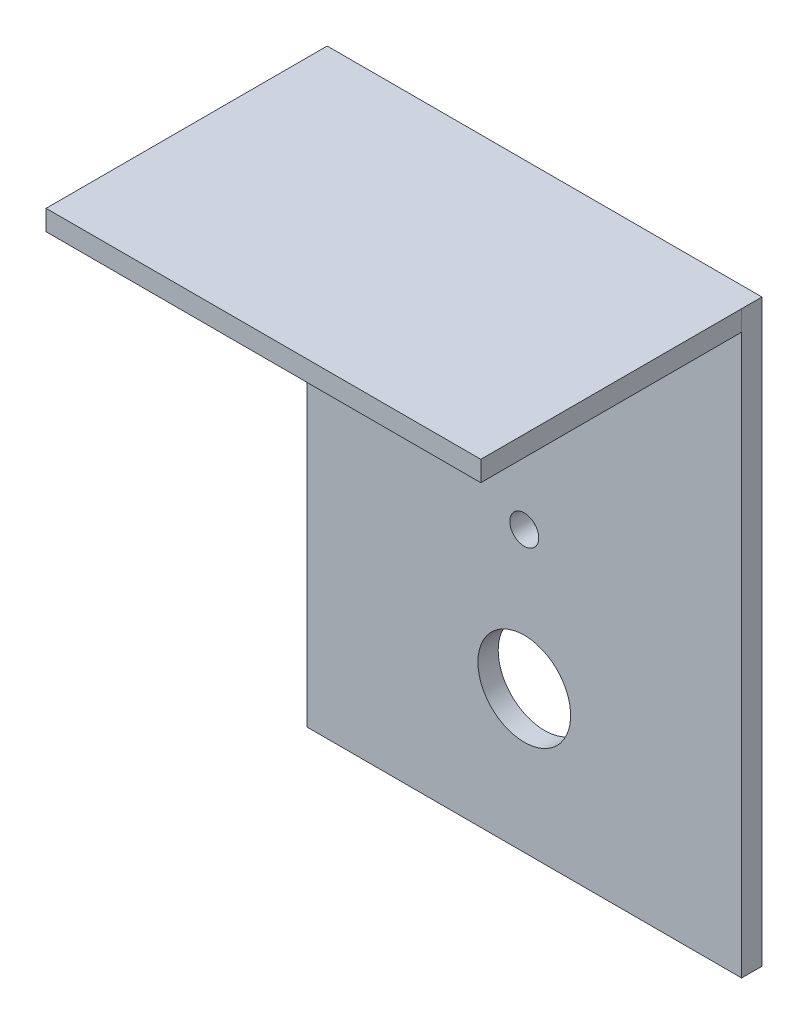
ISO-10303-21;
HEADER;
FILE_DESCRIPTION(('STEP AP214'),'2;1');
FILE_NAME('part.step','',(''),(''),'','','');
FILE_SCHEMA(('AUTOMOTIVE_DESIGN { 1 0 10303 214 1 1 1 1 }'));
ENDSEC;
DATA;
#1=APPLICATION_CONTEXT('core data for automotive mechanical design processes');
#2=APPLICATION_PROTOCOL_DEFINITION('international standard','automotive_design',2000,#1);
#3=PRODUCT_CONTEXT('',#1,'mechanical');
#4=PRODUCT('Part','Part','',(#3));
#5=PRODUCT_RELATED_PRODUCT_CATEGORY('part','',(#4));
#6=PRODUCT_DEFINITION_FORMATION('','',#4);
#7=PRODUCT_DEFINITION_CONTEXT('part definition',#1,'design');
#8=PRODUCT_DEFINITION('design','',#6,#7);
#9=PRODUCT_DEFINITION_SHAPE('','',#8);
#10=(LENGTH_UNIT() NAMED_UNIT(*) SI_UNIT(.MILLI.,.METRE.));
#11=(NAMED_UNIT(*) PLANE_ANGLE_UNIT() SI_UNIT($,.RADIAN.));
#12=(NAMED_UNIT(*) SI_UNIT($,.STERADIAN.) SOLID_ANGLE_UNIT());
#13=UNCERTAINTY_MEASURE_WITH_UNIT(LENGTH_MEASURE(1.E-05),#10,'distance_accuracy_value','');
#14=(GEOMETRIC_REPRESENTATION_CONTEXT(3) GLOBAL_UNCERTAINTY_ASSIGNED_CONTEXT((#13)) GLOBAL_UNIT_ASSIGNED_CONTEXT((#10,
#11,#12)) REPRESENTATION_CONTEXT('',''));
#15=CARTESIAN_POINT('',(0.,0.,0.));
#16=DIRECTION('',(0.,0.,1.));
#17=DIRECTION('',(1.,0.,0.));
#18=AXIS2_PLACEMENT_3D('',#15,#16,#17);
#19=CARTESIAN_POINT('',(0.,3.5,0.));
#20=DIRECTION('',(-1.,0.,0.));
#21=DIRECTION('',(0.,0.,1.));
#22=AXIS2_PLACEMENT_3D('',#19,#20,#21);
#23=PLANE('',#22);
#24=DIRECTION('',(0.,0.,-1.));
#25=VECTOR('',#24,1.);
#26=CARTESIAN_POINT('',(0.,0.,0.));
#27=LINE('',#26,#25);
#28=CARTESIAN_POINT('',(0.,0.,0.));
#29=VERTEX_POINT('',#28);
#30=CARTESIAN_POINT('',(0.,0.,-45.));
#31=VERTEX_POINT('',#30);
#32=EDGE_CURVE('E139',#29,#31,#27,.T.);
#33=ORIENTED_EDGE('',*,*,#32,.F.);
#34=DIRECTION('',(0.,-1.,0.));
#35=VECTOR('',#34,1.);
#36=CARTESIAN_POINT('',(0.,3.5,0.));
#37=LINE('',#36,#35);
#38=CARTESIAN_POINT('',(0.,3.5,0.));
#39=VERTEX_POINT('',#38);
#40=EDGE_CURVE('E11',#39,#29,#37,.T.);
#41=ORIENTED_EDGE('',*,*,#40,.F.);
#42=DIRECTION('',(0.,0.,-1.));
#43=VECTOR('',#42,1.);
#44=CARTESIAN_POINT('',(0.,3.5,0.));
#45=LINE('',#44,#43);
#46=CARTESIAN_POINT('',(0.,3.5,-48.5));
#47=VERTEX_POINT('',#46);
#48=EDGE_CURVE('E99',#39,#47,#45,.T.);
#49=ORIENTED_EDGE('',*,*,#48,.T.);
#50=DIRECTION('',(0.,1.,0.));
#51=VECTOR('',#50,1.);
#52=CARTESIAN_POINT('',(0.,3.5,-48.5));
#53=LINE('',#52,#51);
#54=CARTESIAN_POINT('',(0.,-96.5,-48.5));
#55=VERTEX_POINT('',#54);
#56=EDGE_CURVE('E103',#55,#47,#53,.T.);
#57=ORIENTED_EDGE('',*,*,#56,.F.);
#58=DIRECTION('',(0.,0.,1.));
#59=VECTOR('',#58,1.);
#60=CARTESIAN_POINT('',(0.,-96.5,-48.5));
#61=LINE('',#60,#59);
#62=CARTESIAN_POINT('',(0.,-96.5,-45.));
#63=VERTEX_POINT('',#62);
#64=EDGE_CURVE('E129',#55,#63,#61,.T.);
#65=ORIENTED_EDGE('',*,*,#64,.T.);
#66=DIRECTION('',(0.,1.,0.));
#67=VECTOR('',#66,1.);
#68=CARTESIAN_POINT('',(0.,3.5,-45.));
#69=LINE('',#68,#67);
#70=EDGE_CURVE('E130',#63,#31,#69,.T.);
#71=ORIENTED_EDGE('',*,*,#70,.T.);
#72=EDGE_LOOP('',(#33,#41,#49,#57,#65,#71));
#73=FACE_BOUND('',#72,.T.);
#74=ADVANCED_FACE('F33',(#73),#23,.T.);
#75=CARTESIAN_POINT('',(0.,3.5,0.));
#76=DIRECTION('',(0.,0.,-1.));
#77=DIRECTION('',(-1.,0.,0.));
#78=AXIS2_PLACEMENT_3D('',#75,#76,#77);
#79=PLANE('',#78);
#80=DIRECTION('',(1.,0.,0.));
#81=VECTOR('',#80,1.);
#82=CARTESIAN_POINT('',(0.,0.,0.));
#83=LINE('',#82,#81);
#84=CARTESIAN_POINT('',(75.,0.,0.));
#85=VERTEX_POINT('',#84);
#86=EDGE_CURVE('E105',#29,#85,#83,.T.);
#87=ORIENTED_EDGE('',*,*,#86,.T.);
#88=DIRECTION('',(0.,-1.,0.));
#89=VECTOR('',#88,1.);
#90=CARTESIAN_POINT('',(75.,3.5,0.));
#91=LINE('',#90,#89);
#92=CARTESIAN_POINT('',(75.,3.5,0.));
#93=VERTEX_POINT('',#92);
#94=EDGE_CURVE('E41',#93,#85,#91,.T.);
#95=ORIENTED_EDGE('',*,*,#94,.F.);
#96=DIRECTION('',(1.,0.,0.));
#97=VECTOR('',#96,1.);
#98=CARTESIAN_POINT('',(0.,3.5,0.));
#99=LINE('',#98,#97);
#100=EDGE_CURVE('E144',#39,#93,#99,.T.);
#101=ORIENTED_EDGE('',*,*,#100,.F.);
#102=ORIENTED_EDGE('',*,*,#40,.T.);
#103=EDGE_LOOP('',(#87,#95,#101,#102));
#104=FACE_BOUND('',#103,.T.);
#105=ADVANCED_FACE('F185',(#104),#79,.F.);
#106=CARTESIAN_POINT('',(75.,3.5,0.));
#107=DIRECTION('',(-1.,0.,0.));
#108=DIRECTION('',(0.,0.,1.));
#109=AXIS2_PLACEMENT_3D('',#106,#107,#108);
#110=PLANE('',#109);
#111=DIRECTION('',(0.,0.,-1.));
#112=VECTOR('',#111,1.);
#113=CARTESIAN_POINT('',(75.,0.,0.));
#114=LINE('',#113,#112);
#115=CARTESIAN_POINT('',(75.,0.,-45.));
#116=VERTEX_POINT('',#115);
#117=EDGE_CURVE('E150',#85,#116,#114,.T.);
#118=ORIENTED_EDGE('',*,*,#117,.T.);
#119=DIRECTION('',(0.,-1.,0.));
#120=VECTOR('',#119,1.);
#121=CARTESIAN_POINT('',(75.,3.5,-45.));
#122=LINE('',#121,#120);
#123=CARTESIAN_POINT('',(75.,3.5,-45.));
#124=VERTEX_POINT('',#123);
#125=EDGE_CURVE('E36',#124,#116,#122,.T.);
#126=ORIENTED_EDGE('',*,*,#125,.F.);
#127=DIRECTION('',(0.,0.,-1.));
#128=VECTOR('',#127,1.);
#129=CARTESIAN_POINT('',(75.,3.5,0.));
#130=LINE('',#129,#128);
#131=EDGE_CURVE('E142',#93,#124,#130,.T.);
#132=ORIENTED_EDGE('',*,*,#131,.F.);
#133=ORIENTED_EDGE('',*,*,#94,.T.);
#134=EDGE_LOOP('',(#118,#126,#132,#133));
#135=FACE_BOUND('',#134,.T.);
#136=ADVANCED_FACE('F161',(#135),#110,.F.);
#137=CARTESIAN_POINT('',(0.,3.5,-45.));
#138=DIRECTION('',(0.,0.,-1.));
#139=DIRECTION('',(-1.,0.,0.));
#140=AXIS2_PLACEMENT_3D('',#137,#138,#139);
#141=PLANE('',#140);
#142=DIRECTION('',(0.,-1.,0.));
#143=VECTOR('',#142,1.);
#144=CARTESIAN_POINT('',(74.9993374443676,3.5,-45.));
#145=LINE('',#144,#143);
#146=CARTESIAN_POINT('',(74.9993374443676,3.5,-45.));
#147=VERTEX_POINT('',#146);
#148=CARTESIAN_POINT('',(74.9993374443676,0.,-45.));
#149=VERTEX_POINT('',#148);
#150=EDGE_CURVE('E49',#147,#149,#145,.T.);
#151=ORIENTED_EDGE('',*,*,#150,.F.);
#152=DIRECTION('',(1.,0.,0.));
#153=VECTOR('',#152,1.);
#154=CARTESIAN_POINT('',(0.,3.5,-45.));
#155=LINE('',#154,#153);
#156=EDGE_CURVE('E76',#147,#124,#155,.T.);
#157=ORIENTED_EDGE('',*,*,#156,.T.);
#158=ORIENTED_EDGE('',*,*,#125,.T.);
#159=DIRECTION('',(1.,0.,0.));
#160=VECTOR('',#159,1.);
#161=CARTESIAN_POINT('',(0.,0.,-45.));
#162=LINE('',#161,#160);
#163=EDGE_CURVE('E147',#149,#116,#162,.T.);
#164=ORIENTED_EDGE('',*,*,#163,.F.);
#165=EDGE_LOOP('',(#151,#157,#158,#164));
#166=FACE_BOUND('',#165,.T.);
#167=ADVANCED_FACE('F159',(#166),#141,.T.);
#168=CARTESIAN_POINT('',(0.,3.5,0.));
#169=DIRECTION('',(0.,-1.,0.));
#170=DIRECTION('',(0.,0.,-1.));
#171=AXIS2_PLACEMENT_3D('',#168,#169,#170);
#172=PLANE('',#171);
#173=ORIENTED_EDGE('',*,*,#48,.F.);
#174=ORIENTED_EDGE('',*,*,#100,.T.);
#175=ORIENTED_EDGE('',*,*,#131,.T.);
#176=ORIENTED_EDGE('',*,*,#156,.F.);
#177=DIRECTION('',(0.,0.,1.));
#178=VECTOR('',#177,1.);
#179=CARTESIAN_POINT('',(74.9993374443676,3.5,-48.5));
#180=LINE('',#179,#178);
#181=CARTESIAN_POINT('',(74.9993374443676,3.5,-48.5));
#182=VERTEX_POINT('',#181);
#183=EDGE_CURVE('E111',#182,#147,#180,.T.);
#184=ORIENTED_EDGE('',*,*,#183,.F.);
#185=DIRECTION('',(1.,0.,0.));
#186=VECTOR('',#185,1.);
#187=CARTESIAN_POINT('',(0.,3.5,-48.5));
#188=LINE('',#187,#186);
#189=EDGE_CURVE('E108',#47,#182,#188,.T.);
#190=ORIENTED_EDGE('',*,*,#189,.F.);
#191=EDGE_LOOP('',(#173,#174,#175,#176,#184,#190));
#192=FACE_BOUND('',#191,.T.);
#193=ADVANCED_FACE('F109',(#192),#172,.F.);
#194=CARTESIAN_POINT('',(0.,0.,0.));
#195=DIRECTION('',(0.,-1.,0.));
#196=DIRECTION('',(0.,0.,-1.));
#197=AXIS2_PLACEMENT_3D('',#194,#195,#196);
#198=PLANE('',#197);
#199=ORIENTED_EDGE('',*,*,#32,.T.);
#200=EDGE_CURVE('E148',#31,#149,#162,.T.);
#201=ORIENTED_EDGE('',*,*,#200,.T.);
#202=ORIENTED_EDGE('',*,*,#163,.T.);
#203=ORIENTED_EDGE('',*,*,#117,.F.);
#204=ORIENTED_EDGE('',*,*,#86,.F.);
#205=EDGE_LOOP('',(#199,#201,#202,#203,#204));
#206=FACE_BOUND('',#205,.T.);
#207=ADVANCED_FACE('F163',(#206),#198,.T.);
#208=CARTESIAN_POINT('',(0.,0.,-45.));
#209=DIRECTION('',(0.,0.,1.));
#210=DIRECTION('',(1.,0.,0.));
#211=AXIS2_PLACEMENT_3D('',#208,#209,#210);
#212=PLANE('',#211);
#213=CARTESIAN_POINT('',(37.4999073397654,-24.4705522302074,-45.));
#214=DIRECTION('',(0.,0.,1.));
#215=DIRECTION('',(1.,0.,0.));
#216=AXIS2_PLACEMENT_3D('',#213,#214,#215);
#217=CIRCLE('',#216,8.);
#218=CARTESIAN_POINT('',(29.4999073397654,-24.4705522302074,-45.));
#219=VERTEX_POINT('',#218);
#220=EDGE_CURVE('E124',#219,#219,#217,.T.);
#221=ORIENTED_EDGE('',*,*,#220,.F.);
#222=EDGE_LOOP('',(#221));
#223=FACE_BOUND('',#222,.T.);
#224=CARTESIAN_POINT('',(37.4999073397654,-72.0294477697926,-45.));
#225=DIRECTION('',(0.,0.,1.));
#226=DIRECTION('',(1.,0.,0.));
#227=AXIS2_PLACEMENT_3D('',#224,#225,#226);
#228=CIRCLE('',#227,8.00000000000001);
#229=CARTESIAN_POINT('',(29.4999073397654,-72.0294477697926,-45.));
#230=VERTEX_POINT('',#229);
#231=EDGE_CURVE('E266',#230,#230,#228,.T.);
#232=ORIENTED_EDGE('',*,*,#231,.F.);
#233=EDGE_LOOP('',(#232));
#234=FACE_BOUND('',#233,.T.);
#235=CARTESIAN_POINT('',(37.4996687221838,-48.25,-45.));
#236=DIRECTION('',(0.,0.,1.));
#237=DIRECTION('',(1.,0.,0.));
#238=AXIS2_PLACEMENT_3D('',#235,#236,#237);
#239=CIRCLE('',#238,2.5);
#240=CARTESIAN_POINT('',(34.9996687221838,-48.25,-45.));
#241=VERTEX_POINT('',#240);
#242=EDGE_CURVE('E262',#241,#241,#239,.T.);
#243=ORIENTED_EDGE('',*,*,#242,.F.);
#244=EDGE_LOOP('',(#243));
#245=FACE_BOUND('',#244,.T.);
#246=ORIENTED_EDGE('',*,*,#200,.F.);
#247=ORIENTED_EDGE('',*,*,#70,.F.);
#248=DIRECTION('',(-1.,0.,0.));
#249=VECTOR('',#248,1.);
#250=CARTESIAN_POINT('',(0.,-96.5,-45.));
#251=LINE('',#250,#249);
#252=CARTESIAN_POINT('',(74.9993374443676,-96.5,-45.));
#253=VERTEX_POINT('',#252);
#254=EDGE_CURVE('E120',#253,#63,#251,.T.);
#255=ORIENTED_EDGE('',*,*,#254,.F.);
#256=EDGE_CURVE('E133',#149,#253,#145,.T.);
#257=ORIENTED_EDGE('',*,*,#256,.F.);
#258=EDGE_LOOP('',(#246,#247,#255,#257));
#259=FACE_BOUND('',#258,.T.);
#260=ADVANCED_FACE('F167',(#223,#234,#245,#259),#212,.T.);
#261=CARTESIAN_POINT('',(74.9993374443676,3.5,-48.5));
#262=DIRECTION('',(-1.,0.,0.));
#263=DIRECTION('',(0.,-1.,0.));
#264=AXIS2_PLACEMENT_3D('',#261,#262,#263);
#265=PLANE('',#264);
#266=ORIENTED_EDGE('',*,*,#150,.T.);
#267=ORIENTED_EDGE('',*,*,#256,.T.);
#268=DIRECTION('',(0.,0.,1.));
#269=VECTOR('',#268,1.);
#270=CARTESIAN_POINT('',(74.9993374443676,-96.5,-48.5));
#271=LINE('',#270,#269);
#272=CARTESIAN_POINT('',(74.9993374443676,-96.5,-48.5));
#273=VERTEX_POINT('',#272);
#274=EDGE_CURVE('E136',#273,#253,#271,.T.);
#275=ORIENTED_EDGE('',*,*,#274,.F.);
#276=DIRECTION('',(0.,-1.,0.));
#277=VECTOR('',#276,1.);
#278=CARTESIAN_POINT('',(74.9993374443676,3.5,-48.5));
#279=LINE('',#278,#277);
#280=EDGE_CURVE('E114',#182,#273,#279,.T.);
#281=ORIENTED_EDGE('',*,*,#280,.F.);
#282=ORIENTED_EDGE('',*,*,#183,.T.);
#283=EDGE_LOOP('',(#266,#267,#275,#281,#282));
#284=FACE_BOUND('',#283,.T.);
#285=ADVANCED_FACE('F173',(#284),#265,.F.);
#286=CARTESIAN_POINT('',(0.,-96.5,-48.5));
#287=DIRECTION('',(0.,1.,0.));
#288=DIRECTION('',(-1.,0.,0.));
#289=AXIS2_PLACEMENT_3D('',#286,#287,#288);
#290=PLANE('',#289);
#291=ORIENTED_EDGE('',*,*,#254,.T.);
#292=ORIENTED_EDGE('',*,*,#64,.F.);
#293=DIRECTION('',(-1.,0.,0.));
#294=VECTOR('',#293,1.);
#295=CARTESIAN_POINT('',(0.,-96.5,-48.5));
#296=LINE('',#295,#294);
#297=EDGE_CURVE('E118',#273,#55,#296,.T.);
#298=ORIENTED_EDGE('',*,*,#297,.F.);
#299=ORIENTED_EDGE('',*,*,#274,.T.);
#300=EDGE_LOOP('',(#291,#292,#298,#299));
#301=FACE_BOUND('',#300,.T.);
#302=ADVANCED_FACE('F170',(#301),#290,.F.);
#303=CARTESIAN_POINT('',(0.,0.,-48.5));
#304=DIRECTION('',(0.,0.,1.));
#305=DIRECTION('',(1.,0.,0.));
#306=AXIS2_PLACEMENT_3D('',#303,#304,#305);
#307=PLANE('',#306);
#308=CARTESIAN_POINT('',(37.4999073397654,-24.4705522302074,-48.5));
#309=DIRECTION('',(0.,0.,-1.));
#310=DIRECTION('',(-1.,0.,0.));
#311=AXIS2_PLACEMENT_3D('',#308,#309,#310);
#312=CIRCLE('',#311,8.);
#313=CARTESIAN_POINT('',(29.4999073397654,-24.4705522302074,-48.5));
#314=VERTEX_POINT('',#313);
#315=EDGE_CURVE('E261',#314,#314,#312,.T.);
#316=ORIENTED_EDGE('',*,*,#315,.F.);
#317=EDGE_LOOP('',(#316));
#318=FACE_BOUND('',#317,.T.);
#319=CARTESIAN_POINT('',(37.4999073397654,-72.0294477697926,-48.5));
#320=DIRECTION('',(0.,0.,-1.));
#321=DIRECTION('',(1.,0.,0.));
#322=AXIS2_PLACEMENT_3D('',#319,#320,#321);
#323=CIRCLE('',#322,8.00000000000001);
#324=CARTESIAN_POINT('',(29.4999073397654,-72.0294477697926,-48.5));
#325=VERTEX_POINT('',#324);
#326=EDGE_CURVE('E263',#325,#325,#323,.T.);
#327=ORIENTED_EDGE('',*,*,#326,.F.);
#328=EDGE_LOOP('',(#327));
#329=FACE_BOUND('',#328,.T.);
#330=CARTESIAN_POINT('',(37.4996687221838,-48.25,-48.5));
#331=DIRECTION('',(0.,0.,-1.));
#332=DIRECTION('',(-1.,0.,0.));
#333=AXIS2_PLACEMENT_3D('',#330,#331,#332);
#334=CIRCLE('',#333,2.5);
#335=CARTESIAN_POINT('',(34.9996687221838,-48.25,-48.5));
#336=VERTEX_POINT('',#335);
#337=EDGE_CURVE('E269',#336,#336,#334,.T.);
#338=ORIENTED_EDGE('',*,*,#337,.F.);
#339=EDGE_LOOP('',(#338));
#340=FACE_BOUND('',#339,.T.);
#341=ORIENTED_EDGE('',*,*,#56,.T.);
#342=ORIENTED_EDGE('',*,*,#189,.T.);
#343=ORIENTED_EDGE('',*,*,#280,.T.);
#344=ORIENTED_EDGE('',*,*,#297,.T.);
#345=EDGE_LOOP('',(#341,#342,#343,#344));
#346=FACE_BOUND('',#345,.T.);
#347=ADVANCED_FACE('F116',(#318,#329,#340,#346),#307,.F.);
#348=CARTESIAN_POINT('',(37.4996687221838,-48.25,0.));
#349=DIRECTION('',(0.,0.,-1.));
#350=DIRECTION('',(-1.,0.,0.));
#351=AXIS2_PLACEMENT_3D('',#348,#349,#350);
#352=CYLINDRICAL_SURFACE('',#351,2.5);
#353=CARTESIAN_POINT('',(34.9996687221838,-48.25,-45.));
#354=CARTESIAN_POINT('',(34.9996687221838,-48.25,-45.0364583333333));
#355=CARTESIAN_POINT('',(34.9996687221838,-48.25,-45.0729166666667));
#356=CARTESIAN_POINT('',(34.9996687221838,-48.25,-45.1458333333333));
#357=CARTESIAN_POINT('',(34.9996687221838,-48.25,-45.1822916666667));
#358=CARTESIAN_POINT('',(34.9996687221838,-48.25,-45.2552083333333));
#359=CARTESIAN_POINT('',(34.9996687221838,-48.25,-45.2916666666667));
#360=CARTESIAN_POINT('',(34.9996687221838,-48.25,-45.3645833333333));
#361=CARTESIAN_POINT('',(34.9996687221838,-48.25,-45.4010416666667));
#362=CARTESIAN_POINT('',(34.9996687221838,-48.25,-45.4739583333333));
#363=CARTESIAN_POINT('',(34.9996687221838,-48.25,-45.5104166666667));
#364=CARTESIAN_POINT('',(34.9996687221838,-48.25,-45.5833333333333));
#365=CARTESIAN_POINT('',(34.9996687221838,-48.25,-45.6197916666667));
#366=CARTESIAN_POINT('',(34.9996687221838,-48.25,-45.6927083333333));
#367=CARTESIAN_POINT('',(34.9996687221838,-48.25,-45.7291666666667));
#368=CARTESIAN_POINT('',(34.9996687221838,-48.25,-45.8020833333333));
#369=CARTESIAN_POINT('',(34.9996687221838,-48.25,-45.8385416666667));
#370=CARTESIAN_POINT('',(34.9996687221838,-48.25,-45.9114583333333));
#371=CARTESIAN_POINT('',(34.9996687221838,-48.25,-45.9479166666667));
#372=CARTESIAN_POINT('',(34.9996687221838,-48.25,-46.0208333333333));
#373=CARTESIAN_POINT('',(34.9996687221838,-48.25,-46.0572916666667));
#374=CARTESIAN_POINT('',(34.9996687221838,-48.25,-46.1302083333333));
#375=CARTESIAN_POINT('',(34.9996687221838,-48.25,-46.1666666666667));
#376=CARTESIAN_POINT('',(34.9996687221838,-48.25,-46.2395833333333));
#377=CARTESIAN_POINT('',(34.9996687221838,-48.25,-46.2760416666667));
#378=CARTESIAN_POINT('',(34.9996687221838,-48.25,-46.3489583333333));
#379=CARTESIAN_POINT('',(34.9996687221838,-48.25,-46.3854166666667));
#380=CARTESIAN_POINT('',(34.9996687221838,-48.25,-46.4583333333333));
#381=CARTESIAN_POINT('',(34.9996687221838,-48.25,-46.4947916666667));
#382=CARTESIAN_POINT('',(34.9996687221838,-48.25,-46.5677083333333));
#383=CARTESIAN_POINT('',(34.9996687221838,-48.25,-46.6041666666667));
#384=CARTESIAN_POINT('',(34.9996687221838,-48.25,-46.6770833333333));
#385=CARTESIAN_POINT('',(34.9996687221838,-48.25,-46.7135416666667));
#386=CARTESIAN_POINT('',(34.9996687221838,-48.25,-46.7864583333333));
#387=CARTESIAN_POINT('',(34.9996687221838,-48.25,-46.8229166666667));
#388=CARTESIAN_POINT('',(34.9996687221838,-48.25,-46.8958333333333));
#389=CARTESIAN_POINT('',(34.9996687221838,-48.25,-46.9322916666667));
#390=CARTESIAN_POINT('',(34.9996687221838,-48.25,-47.0052083333333));
#391=CARTESIAN_POINT('',(34.9996687221838,-48.25,-47.0416666666667));
#392=CARTESIAN_POINT('',(34.9996687221838,-48.25,-47.1145833333333));
#393=CARTESIAN_POINT('',(34.9996687221838,-48.25,-47.1510416666667));
#394=CARTESIAN_POINT('',(34.9996687221838,-48.25,-47.2239583333333));
#395=CARTESIAN_POINT('',(34.9996687221838,-48.25,-47.2604166666667));
#396=CARTESIAN_POINT('',(34.9996687221838,-48.25,-47.3333333333333));
#397=CARTESIAN_POINT('',(34.9996687221838,-48.25,-47.3697916666667));
#398=CARTESIAN_POINT('',(34.9996687221838,-48.25,-47.4427083333333));
#399=CARTESIAN_POINT('',(34.9996687221838,-48.25,-47.4791666666667));
#400=CARTESIAN_POINT('',(34.9996687221838,-48.25,-47.5520833333333));
#401=CARTESIAN_POINT('',(34.9996687221838,-48.25,-47.5885416666667));
#402=CARTESIAN_POINT('',(34.9996687221838,-48.25,-47.6614583333333));
#403=CARTESIAN_POINT('',(34.9996687221838,-48.25,-47.6979166666667));
#404=CARTESIAN_POINT('',(34.9996687221838,-48.25,-47.7708333333333));
#405=CARTESIAN_POINT('',(34.9996687221838,-48.25,-47.8072916666667));
#406=CARTESIAN_POINT('',(34.9996687221838,-48.25,-47.8802083333333));
#407=CARTESIAN_POINT('',(34.9996687221838,-48.25,-47.9166666666667));
#408=CARTESIAN_POINT('',(34.9996687221838,-48.25,-47.9895833333333));
#409=CARTESIAN_POINT('',(34.9996687221838,-48.25,-48.0260416666667));
#410=CARTESIAN_POINT('',(34.9996687221838,-48.25,-48.0989583333333));
#411=CARTESIAN_POINT('',(34.9996687221838,-48.25,-48.1354166666667));
#412=CARTESIAN_POINT('',(34.9996687221838,-48.25,-48.2083333333333));
#413=CARTESIAN_POINT('',(34.9996687221838,-48.25,-48.2447916666667));
#414=CARTESIAN_POINT('',(34.9996687221838,-48.25,-48.3177083333333));
#415=CARTESIAN_POINT('',(34.9996687221838,-48.25,-48.3541666666667));
#416=CARTESIAN_POINT('',(34.9996687221838,-48.25,-48.4270833333333));
#417=CARTESIAN_POINT('',(34.9996687221838,-48.25,-48.4635416666667));
#418=CARTESIAN_POINT('',(34.9996687221838,-48.25,-48.5));
#419=B_SPLINE_CURVE_WITH_KNOTS('',3,(#353,#354,#355,#356,#357,#358,#359,#360,#361,#362,#363,
#364,#365,#366,#367,#368,#369,#370,#371,#372,#373,#374,#375,#376,#377,#378,#379,#380,#381,#382,
#383,#384,#385,#386,#387,#388,#389,#390,#391,#392,#393,#394,#395,#396,#397,#398,#399,#400,#401,
#402,#403,#404,#405,#406,#407,#408,#409,#410,#411,#412,#413,#414,#415,#416,#417,#418),
.UNSPECIFIED.,.F.,.F.,(4,2,2,2,2,2,2,2,2,2,2,2,2,2,2,2,2,2,2,2,2,2,2,2,2,2,2,2,2,2,2,2,4),(0.,
0.109375000000002,0.218749999999997,0.328124999999999,0.4375,0.546874999999995,
0.656249999999997,0.765624999999999,0.875000000000001,0.984374999999996,1.09375,1.203125,
1.31249999999999,1.421875,1.53125,1.64062499999999,1.74999999999999,1.859375,1.96874999999999,
2.07812499999999,2.1875,2.29687499999999,2.40624999999999,2.51562499999999,2.62499999999999,
2.73437499999999,2.84374999999999,2.95312499999999,3.06249999999999,3.17187499999999,
3.28124999999999,3.39062499999999,3.49999999999999),.UNSPECIFIED.);
#420=EDGE_CURVE('BSEAM222',#241,#336,#419,.T.);
#421=ORIENTED_EDGE('',*,*,#242,.T.);
#422=ORIENTED_EDGE('',*,*,#337,.T.);
#423=ORIENTED_EDGE('',*,*,#420,.T.);
#424=ORIENTED_EDGE('',*,*,#420,.F.);
#425=EDGE_LOOP('',(#421,#423,#422,#424));
#426=FACE_BOUND('',#425,.T.);
#427=ADVANCED_FACE('F222',(#426),#352,.F.);
#428=CARTESIAN_POINT('',(37.4999073397654,-72.0294477697926,0.));
#429=DIRECTION('',(0.,0.,-1.));
#430=DIRECTION('',(-1.,0.,0.));
#431=AXIS2_PLACEMENT_3D('',#428,#429,#430);
#432=CYLINDRICAL_SURFACE('',#431,8.00000000000001);
#433=CARTESIAN_POINT('',(29.4999073397654,-72.0294477697926,-45.));
#434=CARTESIAN_POINT('',(29.4999073397654,-72.0294477697926,-45.0364583333333));
#435=CARTESIAN_POINT('',(29.4999073397654,-72.0294477697926,-45.0729166666667));
#436=CARTESIAN_POINT('',(29.4999073397654,-72.0294477697926,-45.1458333333333));
#437=CARTESIAN_POINT('',(29.4999073397654,-72.0294477697926,-45.1822916666667));
#438=CARTESIAN_POINT('',(29.4999073397654,-72.0294477697926,-45.2552083333333));
#439=CARTESIAN_POINT('',(29.4999073397654,-72.0294477697926,-45.2916666666667));
#440=CARTESIAN_POINT('',(29.4999073397654,-72.0294477697926,-45.3645833333333));
#441=CARTESIAN_POINT('',(29.4999073397654,-72.0294477697926,-45.4010416666667));
#442=CARTESIAN_POINT('',(29.4999073397654,-72.0294477697926,-45.4739583333333));
#443=CARTESIAN_POINT('',(29.4999073397654,-72.0294477697926,-45.5104166666667));
#444=CARTESIAN_POINT('',(29.4999073397654,-72.0294477697926,-45.5833333333333));
#445=CARTESIAN_POINT('',(29.4999073397654,-72.0294477697926,-45.6197916666667));
#446=CARTESIAN_POINT('',(29.4999073397654,-72.0294477697926,-45.6927083333333));
#447=CARTESIAN_POINT('',(29.4999073397654,-72.0294477697926,-45.7291666666667));
#448=CARTESIAN_POINT('',(29.4999073397654,-72.0294477697926,-45.8020833333333));
#449=CARTESIAN_POINT('',(29.4999073397654,-72.0294477697926,-45.8385416666667));
#450=CARTESIAN_POINT('',(29.4999073397654,-72.0294477697926,-45.9114583333333));
#451=CARTESIAN_POINT('',(29.4999073397654,-72.0294477697926,-45.9479166666667));
#452=CARTESIAN_POINT('',(29.4999073397654,-72.0294477697926,-46.0208333333333));
#453=CARTESIAN_POINT('',(29.4999073397654,-72.0294477697926,-46.0572916666667));
#454=CARTESIAN_POINT('',(29.4999073397654,-72.0294477697926,-46.1302083333333));
#455=CARTESIAN_POINT('',(29.4999073397654,-72.0294477697926,-46.1666666666667));
#456=CARTESIAN_POINT('',(29.4999073397654,-72.0294477697926,-46.2395833333333));
#457=CARTESIAN_POINT('',(29.4999073397654,-72.0294477697926,-46.2760416666667));
#458=CARTESIAN_POINT('',(29.4999073397654,-72.0294477697926,-46.3489583333333));
#459=CARTESIAN_POINT('',(29.4999073397654,-72.0294477697926,-46.3854166666667));
#460=CARTESIAN_POINT('',(29.4999073397654,-72.0294477697926,-46.4583333333333));
#461=CARTESIAN_POINT('',(29.4999073397654,-72.0294477697926,-46.4947916666667));
#462=CARTESIAN_POINT('',(29.4999073397654,-72.0294477697926,-46.5677083333333));
#463=CARTESIAN_POINT('',(29.4999073397654,-72.0294477697926,-46.6041666666667));
#464=CARTESIAN_POINT('',(29.4999073397654,-72.0294477697926,-46.6770833333333));
#465=CARTESIAN_POINT('',(29.4999073397654,-72.0294477697926,-46.7135416666667));
#466=CARTESIAN_POINT('',(29.4999073397654,-72.0294477697926,-46.7864583333333));
#467=CARTESIAN_POINT('',(29.4999073397654,-72.0294477697926,-46.8229166666667));
#468=CARTESIAN_POINT('',(29.4999073397654,-72.0294477697926,-46.8958333333333));
#469=CARTESIAN_POINT('',(29.4999073397654,-72.0294477697926,-46.9322916666667));
#470=CARTESIAN_POINT('',(29.4999073397654,-72.0294477697926,-47.0052083333333));
#471=CARTESIAN_POINT('',(29.4999073397654,-72.0294477697926,-47.0416666666667));
#472=CARTESIAN_POINT('',(29.4999073397654,-72.0294477697926,-47.1145833333333));
#473=CARTESIAN_POINT('',(29.4999073397654,-72.0294477697926,-47.1510416666667));
#474=CARTESIAN_POINT('',(29.4999073397654,-72.0294477697926,-47.2239583333333));
#475=CARTESIAN_POINT('',(29.4999073397654,-72.0294477697926,-47.2604166666667));
#476=CARTESIAN_POINT('',(29.4999073397654,-72.0294477697926,-47.3333333333333));
#477=CARTESIAN_POINT('',(29.4999073397654,-72.0294477697926,-47.3697916666667));
#478=CARTESIAN_POINT('',(29.4999073397654,-72.0294477697926,-47.4427083333333));
#479=CARTESIAN_POINT('',(29.4999073397654,-72.0294477697926,-47.4791666666667));
#480=CARTESIAN_POINT('',(29.4999073397654,-72.0294477697926,-47.5520833333333));
#481=CARTESIAN_POINT('',(29.4999073397654,-72.0294477697926,-47.5885416666667));
#482=CARTESIAN_POINT('',(29.4999073397654,-72.0294477697926,-47.6614583333333));
#483=CARTESIAN_POINT('',(29.4999073397654,-72.0294477697926,-47.6979166666667));
#484=CARTESIAN_POINT('',(29.4999073397654,-72.0294477697926,-47.7708333333333));
#485=CARTESIAN_POINT('',(29.4999073397654,-72.0294477697926,-47.8072916666667));
#486=CARTESIAN_POINT('',(29.4999073397654,-72.0294477697926,-47.8802083333333));
#487=CARTESIAN_POINT('',(29.4999073397654,-72.0294477697926,-47.9166666666667));
#488=CARTESIAN_POINT('',(29.4999073397654,-72.0294477697926,-47.9895833333333));
#489=CARTESIAN_POINT('',(29.4999073397654,-72.0294477697926,-48.0260416666667));
#490=CARTESIAN_POINT('',(29.4999073397654,-72.0294477697926,-48.0989583333333));
#491=CARTESIAN_POINT('',(29.4999073397654,-72.0294477697926,-48.1354166666667));
#492=CARTESIAN_POINT('',(29.4999073397654,-72.0294477697926,-48.2083333333333));
#493=CARTESIAN_POINT('',(29.4999073397654,-72.0294477697926,-48.2447916666667));
#494=CARTESIAN_POINT('',(29.4999073397654,-72.0294477697926,-48.3177083333333));
#495=CARTESIAN_POINT('',(29.4999073397654,-72.0294477697926,-48.3541666666667));
#496=CARTESIAN_POINT('',(29.4999073397654,-72.0294477697926,-48.4270833333333));
#497=CARTESIAN_POINT('',(29.4999073397654,-72.0294477697926,-48.4635416666667));
#498=CARTESIAN_POINT('',(29.4999073397654,-72.0294477697926,-48.5));
#499=B_SPLINE_CURVE_WITH_KNOTS('',3,(#433,#434,#435,#436,#437,#438,#439,#440,#441,#442,#443,
#444,#445,#446,#447,#448,#449,#450,#451,#452,#453,#454,#455,#456,#457,#458,#459,#460,#461,#462,
#463,#464,#465,#466,#467,#468,#469,#470,#471,#472,#473,#474,#475,#476,#477,#478,#479,#480,#481,
#482,#483,#484,#485,#486,#487,#488,#489,#490,#491,#492,#493,#494,#495,#496,#497,#498),
.UNSPECIFIED.,.F.,.F.,(4,2,2,2,2,2,2,2,2,2,2,2,2,2,2,2,2,2,2,2,2,2,2,2,2,2,2,2,2,2,2,2,4),(0.,
0.109375000000002,0.218749999999997,0.328124999999999,0.4375,0.546874999999995,
0.656249999999997,0.765624999999999,0.875000000000001,0.984374999999996,1.09375,1.203125,
1.31249999999999,1.421875,1.53125,1.64062499999999,1.74999999999999,1.859375,1.96874999999999,
2.07812499999999,2.1875,2.29687499999999,2.40624999999999,2.51562499999999,2.62499999999999,
2.73437499999999,2.84374999999999,2.95312499999999,3.06249999999999,3.17187499999999,
3.28124999999999,3.39062499999999,3.49999999999999),.UNSPECIFIED.);
#500=EDGE_CURVE('BSEAM232',#230,#325,#499,.T.);
#501=ORIENTED_EDGE('',*,*,#231,.T.);
#502=ORIENTED_EDGE('',*,*,#326,.T.);
#503=ORIENTED_EDGE('',*,*,#500,.T.);
#504=ORIENTED_EDGE('',*,*,#500,.F.);
#505=EDGE_LOOP('',(#501,#503,#502,#504));
#506=FACE_BOUND('',#505,.T.);
#507=ADVANCED_FACE('F232',(#506),#432,.F.);
#508=CARTESIAN_POINT('',(37.4999073397654,-24.4705522302074,0.));
#509=DIRECTION('',(0.,0.,-1.));
#510=DIRECTION('',(-1.,0.,0.));
#511=AXIS2_PLACEMENT_3D('',#508,#509,#510);
#512=CYLINDRICAL_SURFACE('',#511,8.);
#513=CARTESIAN_POINT('',(29.4999073397654,-24.4705522302074,-45.));
#514=CARTESIAN_POINT('',(29.4999073397654,-24.4705522302074,-45.0364583333333));
#515=CARTESIAN_POINT('',(29.4999073397654,-24.4705522302074,-45.0729166666667));
#516=CARTESIAN_POINT('',(29.4999073397654,-24.4705522302074,-45.1458333333333));
#517=CARTESIAN_POINT('',(29.4999073397654,-24.4705522302074,-45.1822916666667));
#518=CARTESIAN_POINT('',(29.4999073397654,-24.4705522302074,-45.2552083333333));
#519=CARTESIAN_POINT('',(29.4999073397654,-24.4705522302074,-45.2916666666667));
#520=CARTESIAN_POINT('',(29.4999073397654,-24.4705522302074,-45.3645833333333));
#521=CARTESIAN_POINT('',(29.4999073397654,-24.4705522302074,-45.4010416666667));
#522=CARTESIAN_POINT('',(29.4999073397654,-24.4705522302074,-45.4739583333333));
#523=CARTESIAN_POINT('',(29.4999073397654,-24.4705522302074,-45.5104166666667));
#524=CARTESIAN_POINT('',(29.4999073397654,-24.4705522302074,-45.5833333333333));
#525=CARTESIAN_POINT('',(29.4999073397654,-24.4705522302074,-45.6197916666667));
#526=CARTESIAN_POINT('',(29.4999073397654,-24.4705522302074,-45.6927083333333));
#527=CARTESIAN_POINT('',(29.4999073397654,-24.4705522302074,-45.7291666666667));
#528=CARTESIAN_POINT('',(29.4999073397654,-24.4705522302074,-45.8020833333333));
#529=CARTESIAN_POINT('',(29.4999073397654,-24.4705522302074,-45.8385416666667));
#530=CARTESIAN_POINT('',(29.4999073397654,-24.4705522302074,-45.9114583333333));
#531=CARTESIAN_POINT('',(29.4999073397654,-24.4705522302074,-45.9479166666667));
#532=CARTESIAN_POINT('',(29.4999073397654,-24.4705522302074,-46.0208333333333));
#533=CARTESIAN_POINT('',(29.4999073397654,-24.4705522302074,-46.0572916666667));
#534=CARTESIAN_POINT('',(29.4999073397654,-24.4705522302074,-46.1302083333333));
#535=CARTESIAN_POINT('',(29.4999073397654,-24.4705522302074,-46.1666666666667));
#536=CARTESIAN_POINT('',(29.4999073397654,-24.4705522302074,-46.2395833333333));
#537=CARTESIAN_POINT('',(29.4999073397654,-24.4705522302074,-46.2760416666667));
#538=CARTESIAN_POINT('',(29.4999073397654,-24.4705522302074,-46.3489583333333));
#539=CARTESIAN_POINT('',(29.4999073397654,-24.4705522302074,-46.3854166666667));
#540=CARTESIAN_POINT('',(29.4999073397654,-24.4705522302074,-46.4583333333333));
#541=CARTESIAN_POINT('',(29.4999073397654,-24.4705522302074,-46.4947916666667));
#542=CARTESIAN_POINT('',(29.4999073397654,-24.4705522302074,-46.5677083333333));
#543=CARTESIAN_POINT('',(29.4999073397654,-24.4705522302074,-46.6041666666667));
#544=CARTESIAN_POINT('',(29.4999073397654,-24.4705522302074,-46.6770833333333));
#545=CARTESIAN_POINT('',(29.4999073397654,-24.4705522302074,-46.7135416666667));
#546=CARTESIAN_POINT('',(29.4999073397654,-24.4705522302074,-46.7864583333333));
#547=CARTESIAN_POINT('',(29.4999073397654,-24.4705522302074,-46.8229166666667));
#548=CARTESIAN_POINT('',(29.4999073397654,-24.4705522302074,-46.8958333333333));
#549=CARTESIAN_POINT('',(29.4999073397654,-24.4705522302074,-46.9322916666667));
#550=CARTESIAN_POINT('',(29.4999073397654,-24.4705522302074,-47.0052083333333));
#551=CARTESIAN_POINT('',(29.4999073397654,-24.4705522302074,-47.0416666666667));
#552=CARTESIAN_POINT('',(29.4999073397654,-24.4705522302074,-47.1145833333333));
#553=CARTESIAN_POINT('',(29.4999073397654,-24.4705522302074,-47.1510416666667));
#554=CARTESIAN_POINT('',(29.4999073397654,-24.4705522302074,-47.2239583333333));
#555=CARTESIAN_POINT('',(29.4999073397654,-24.4705522302074,-47.2604166666667));
#556=CARTESIAN_POINT('',(29.4999073397654,-24.4705522302074,-47.3333333333333));
#557=CARTESIAN_POINT('',(29.4999073397654,-24.4705522302074,-47.3697916666667));
#558=CARTESIAN_POINT('',(29.4999073397654,-24.4705522302074,-47.4427083333333));
#559=CARTESIAN_POINT('',(29.4999073397654,-24.4705522302074,-47.4791666666667));
#560=CARTESIAN_POINT('',(29.4999073397654,-24.4705522302074,-47.5520833333333));
#561=CARTESIAN_POINT('',(29.4999073397654,-24.4705522302074,-47.5885416666667));
#562=CARTESIAN_POINT('',(29.4999073397654,-24.4705522302074,-47.6614583333333));
#563=CARTESIAN_POINT('',(29.4999073397654,-24.4705522302074,-47.6979166666667));
#564=CARTESIAN_POINT('',(29.4999073397654,-24.4705522302074,-47.7708333333333));
#565=CARTESIAN_POINT('',(29.4999073397654,-24.4705522302074,-47.8072916666667));
#566=CARTESIAN_POINT('',(29.4999073397654,-24.4705522302074,-47.8802083333333));
#567=CARTESIAN_POINT('',(29.4999073397654,-24.4705522302074,-47.9166666666667));
#568=CARTESIAN_POINT('',(29.4999073397654,-24.4705522302074,-47.9895833333333));
#569=CARTESIAN_POINT('',(29.4999073397654,-24.4705522302074,-48.0260416666667));
#570=CARTESIAN_POINT('',(29.4999073397654,-24.4705522302074,-48.0989583333333));
#571=CARTESIAN_POINT('',(29.4999073397654,-24.4705522302074,-48.1354166666667));
#572=CARTESIAN_POINT('',(29.4999073397654,-24.4705522302074,-48.2083333333333));
#573=CARTESIAN_POINT('',(29.4999073397654,-24.4705522302074,-48.2447916666667));
#574=CARTESIAN_POINT('',(29.4999073397654,-24.4705522302074,-48.3177083333333));
#575=CARTESIAN_POINT('',(29.4999073397654,-24.4705522302074,-48.3541666666667));
#576=CARTESIAN_POINT('',(29.4999073397654,-24.4705522302074,-48.4270833333333));
#577=CARTESIAN_POINT('',(29.4999073397654,-24.4705522302074,-48.4635416666667));
#578=CARTESIAN_POINT('',(29.4999073397654,-24.4705522302074,-48.5));
#579=B_SPLINE_CURVE_WITH_KNOTS('',3,(#513,#514,#515,#516,#517,#518,#519,#520,#521,#522,#523,
#524,#525,#526,#527,#528,#529,#530,#531,#532,#533,#534,#535,#536,#537,#538,#539,#540,#541,#542,
#543,#544,#545,#546,#547,#548,#549,#550,#551,#552,#553,#554,#555,#556,#557,#558,#559,#560,#561,
#562,#563,#564,#565,#566,#567,#568,#569,#570,#571,#572,#573,#574,#575,#576,#577,#578),
.UNSPECIFIED.,.F.,.F.,(4,2,2,2,2,2,2,2,2,2,2,2,2,2,2,2,2,2,2,2,2,2,2,2,2,2,2,2,2,2,2,2,4),(0.,
0.109375000000002,0.218749999999997,0.328124999999999,0.4375,0.546874999999995,
0.656249999999997,0.765624999999999,0.875000000000001,0.984374999999996,1.09375,1.203125,
1.31249999999999,1.421875,1.53125,1.64062499999999,1.74999999999999,1.859375,1.96874999999999,
2.07812499999999,2.1875,2.29687499999999,2.40624999999999,2.51562499999999,2.62499999999999,
2.73437499999999,2.84374999999999,2.95312499999999,3.06249999999999,3.17187499999999,
3.28124999999999,3.39062499999999,3.49999999999999),.UNSPECIFIED.);
#580=EDGE_CURVE('BSEAM242',#219,#314,#579,.T.);
#581=ORIENTED_EDGE('',*,*,#220,.T.);
#582=ORIENTED_EDGE('',*,*,#315,.T.);
#583=ORIENTED_EDGE('',*,*,#580,.T.);
#584=ORIENTED_EDGE('',*,*,#580,.F.);
#585=EDGE_LOOP('',(#581,#583,#582,#584));
#586=FACE_BOUND('',#585,.T.);
#587=ADVANCED_FACE('F242',(#586),#512,.F.);
#588=CLOSED_SHELL('',(#74,#105,#136,#167,#193,#207,#260,#285,#302,#347,#427,#507,#587));
#589=MANIFOLD_SOLID_BREP('B2',#588);
#590=ADVANCED_BREP_SHAPE_REPRESENTATION('',(#18,#589),#14);
#591=SHAPE_DEFINITION_REPRESENTATION(#9,#590);
ENDSEC;
END-ISO-10303-21;
